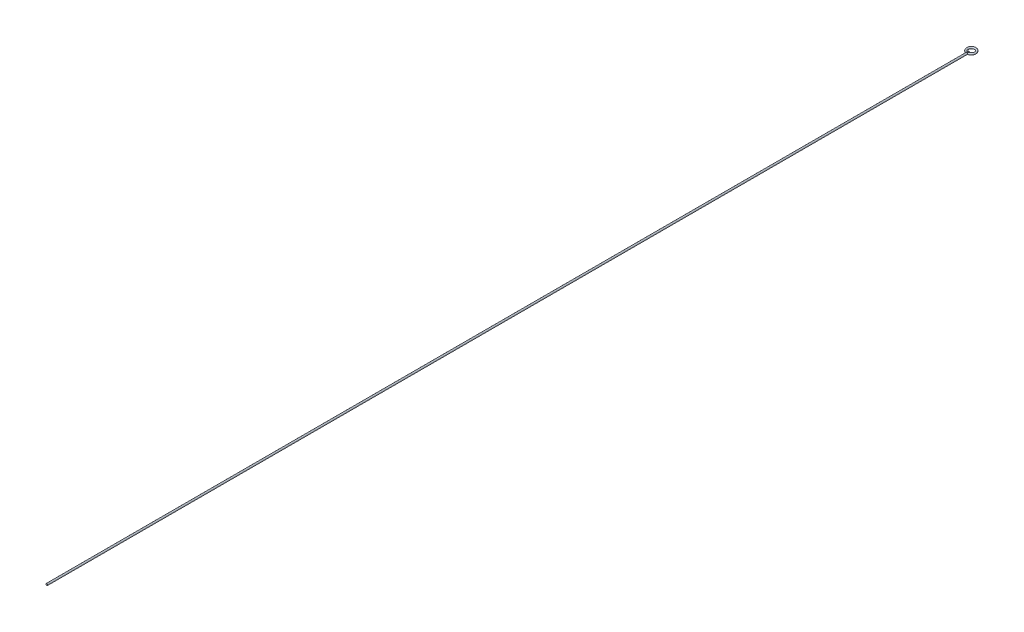
ISO-10303-21;
HEADER;
FILE_DESCRIPTION(('STEP AP214'),'2;1');
FILE_NAME('part.step','',(''),(''),'','','');
FILE_SCHEMA(('AUTOMOTIVE_DESIGN { 1 0 10303 214 1 1 1 1 }'));
ENDSEC;
DATA;
#1=APPLICATION_CONTEXT('core data for automotive mechanical design processes');
#2=APPLICATION_PROTOCOL_DEFINITION('international standard','automotive_design',2000,#1);
#3=PRODUCT_CONTEXT('',#1,'mechanical');
#4=PRODUCT('Part','Part','',(#3));
#5=PRODUCT_RELATED_PRODUCT_CATEGORY('part','',(#4));
#6=PRODUCT_DEFINITION_FORMATION('','',#4);
#7=PRODUCT_DEFINITION_CONTEXT('part definition',#1,'design');
#8=PRODUCT_DEFINITION('design','',#6,#7);
#9=PRODUCT_DEFINITION_SHAPE('','',#8);
#10=(LENGTH_UNIT() NAMED_UNIT(*) SI_UNIT(.MILLI.,.METRE.));
#11=(NAMED_UNIT(*) PLANE_ANGLE_UNIT() SI_UNIT($,.RADIAN.));
#12=(NAMED_UNIT(*) SI_UNIT($,.STERADIAN.) SOLID_ANGLE_UNIT());
#13=UNCERTAINTY_MEASURE_WITH_UNIT(LENGTH_MEASURE(1.E-05),#10,'distance_accuracy_value','');
#14=(GEOMETRIC_REPRESENTATION_CONTEXT(3) GLOBAL_UNCERTAINTY_ASSIGNED_CONTEXT((#13)) GLOBAL_UNIT_ASSIGNED_CONTEXT((#10,
#11,#12)) REPRESENTATION_CONTEXT('',''));
#15=CARTESIAN_POINT('',(0.,0.,0.));
#16=DIRECTION('',(0.,0.,1.));
#17=DIRECTION('',(1.,0.,0.));
#18=AXIS2_PLACEMENT_3D('',#15,#16,#17);
#19=CARTESIAN_POINT('',(0.,0.,2156.));
#20=DIRECTION('',(0.,0.,-1.));
#21=DIRECTION('',(-1.,0.,0.));
#22=AXIS2_PLACEMENT_3D('',#19,#20,#21);
#23=CYLINDRICAL_SURFACE('',#22,2.);
#24=CARTESIAN_POINT('',(0.,0.,6.));
#25=DIRECTION('',(0.,0.,1.));
#26=DIRECTION('',(1.,0.,0.));
#27=AXIS2_PLACEMENT_3D('',#24,#25,#26);
#28=CIRCLE('',#27,2.);
#29=CARTESIAN_POINT('',(2.,0.,6.));
#30=VERTEX_POINT('',#29);
#31=EDGE_CURVE('E143',#30,#30,#28,.T.);
#32=ORIENTED_EDGE('',*,*,#31,.T.);
#33=EDGE_LOOP('',(#32));
#34=FACE_BOUND('',#33,.T.);
#35=CARTESIAN_POINT('',(0.,0.,8.99999999999995));
#36=DIRECTION('',(0.,-0.707106781186547,-0.707106781186547));
#37=DIRECTION('',(0.,0.707106781186547,-0.707106781186547));
#38=AXIS2_PLACEMENT_3D('',#35,#36,#37);
#39=ELLIPSE('',#38,2.82842712474619,2.);
#40=CARTESIAN_POINT('',(1.35264002569453,1.47321585685503,7.52678414314496));
#41=VERTEX_POINT('',#40);
#42=CARTESIAN_POINT('',(-1.35264002569453,1.47321585685503,7.52678414314496));
#43=VERTEX_POINT('',#42);
#44=EDGE_CURVE('E66',#41,#43,#39,.F.);
#45=ORIENTED_EDGE('',*,*,#44,.F.);
#46=CARTESIAN_POINT('',(0.,2.,9.));
#47=CARTESIAN_POINT('',(0.00210812272485549,1.99999999524163,8.99789188802901));
#48=CARTESIAN_POINT('',(0.00421593956644162,1.99999666225178,8.99578333024149));
#49=CARTESIAN_POINT('',(0.167613924135622,1.99948039837144,8.83226960574343));
#50=CARTESIAN_POINT('',(0.327073545426945,1.97949150565761,8.66829200657743));
#51=CARTESIAN_POINT('',(0.559345306955797,1.92185890331424,8.42250655543371));
#52=CARTESIAN_POINT('',(0.635774550072601,1.89795770338682,8.34043033607726));
#53=CARTESIAN_POINT('',(0.785828632202429,1.84089832490799,8.17690254413226));
#54=CARTESIAN_POINT('',(0.859454740640768,1.80774439459674,8.09545070246308));
#55=CARTESIAN_POINT('',(0.986802312314143,1.74073148220367,7.95244891859763));
#56=CARTESIAN_POINT('',(1.04121847231176,1.70877538708495,7.89061593086873));
#57=CARTESIAN_POINT('',(1.14772281824378,1.63913978914488,7.7681871378529));
#58=CARTESIAN_POINT('',(1.19981153935845,1.60146161093816,7.70759104990733));
#59=CARTESIAN_POINT('',(1.30118823189935,1.5202366704838,7.58829101877278));
#60=CARTESIAN_POINT('',(1.35048232911553,1.47670351006603,7.52958306965177));
#61=CARTESIAN_POINT('',(1.44590645589761,1.3834030904459,7.41464671127423));
#62=CARTESIAN_POINT('',(1.49203807201466,1.3336389931221,7.35841706383646));
#63=CARTESIAN_POINT('',(1.59107508834011,1.21482851937822,7.23637955182586));
#64=CARTESIAN_POINT('',(1.64298967668924,1.14400888206332,7.17146570606956));
#65=CARTESIAN_POINT('',(1.73936977351839,0.991323551090359,7.04947167026083));
#66=CARTESIAN_POINT('',(1.78384415074728,0.909471221739623,6.99238216846505));
#67=CARTESIAN_POINT('',(1.85334026653697,0.755288037111378,6.9022751968222));
#68=CARTESIAN_POINT('',(1.88046912857674,0.685383347646647,6.86676841761969));
#69=CARTESIAN_POINT('',(1.92743179933544,0.539316860970757,6.80493837359133));
#70=CARTESIAN_POINT('',(1.94727704682289,0.463165106806872,6.77860071222888));
#71=CARTESIAN_POINT('',(1.97556961285693,0.318783066173252,6.74092329606359));
#72=CARTESIAN_POINT('',(1.98534423195506,0.251273624055717,6.7278429328771));
#73=CARTESIAN_POINT('',(1.99790013385232,0.114464445911381,6.7110261722765));
#74=CARTESIAN_POINT('',(2.00068618016804,0.0451659618898008,6.70728341022207));
#75=CARTESIAN_POINT('',(1.99902507748093,-0.0932269459276112,6.70951183766348));
#76=CARTESIAN_POINT('',(1.99457331702574,-0.162321211505731,6.71548922019384));
#77=CARTESIAN_POINT('',(1.97881704351064,-0.298296919509378,6.73657185136085));
#78=CARTESIAN_POINT('',(1.96750720820041,-0.365176600738755,6.75168418920589));
#79=CARTESIAN_POINT('',(1.93506816593579,-0.512441459084677,6.79480275118913));
#80=CARTESIAN_POINT('',(1.91213546025074,-0.591734040697845,6.82515897002035));
#81=CARTESIAN_POINT('',(1.85856088034207,-0.743125211635407,6.89544348555838));
#82=CARTESIAN_POINT('',(1.82790417359937,-0.815209582570209,6.93539019199368));
#83=CARTESIAN_POINT('',(1.74457274468806,-0.984436833153287,7.04285113385104));
#84=CARTESIAN_POINT('',(1.6883570290898,-1.07721453123317,7.11444602840009));
#85=CARTESIAN_POINT('',(1.56655663215454,-1.24776658358752,7.26689981805269));
#86=CARTESIAN_POINT('',(1.50095088388114,-1.32550625145298,7.34777946086476));
#87=CARTESIAN_POINT('',(1.37952593702835,-1.45000149540649,7.49483605281066));
#88=CARTESIAN_POINT('',(1.32520348461172,-1.49969547185001,7.55980886574149));
#89=CARTESIAN_POINT('',(1.21314827324628,-1.5917071804358,7.69205451956285));
#90=CARTESIAN_POINT('',(1.15541377381436,-1.63402110376991,7.75932852679196));
#91=CARTESIAN_POINT('',(1.03704301514678,-1.71159292484037,7.89543290864361));
#92=CARTESIAN_POINT('',(0.976405158426919,-1.74684688145539,7.96426412882959));
#93=CARTESIAN_POINT('',(0.852660755306097,-1.81047203631426,8.10289576687222));
#94=CARTESIAN_POINT('',(0.78955348783574,-1.83884120651604,8.17269646392042));
#95=CARTESIAN_POINT('',(0.610804546614742,-1.90841633093616,8.36786297402596));
#96=CARTESIAN_POINT('',(0.492836854291632,-1.942200198497,8.49380520408929));
#97=CARTESIAN_POINT('',(0.252404421297302,-1.98776362380408,8.74485234646825));
#98=CARTESIAN_POINT('',(0.129951986381222,-1.99959937761332,8.86995857770249));
#99=CARTESIAN_POINT('',(0.00421596897733761,-1.99999666242279,8.99578329472263));
#100=CARTESIAN_POINT('',(0.00210815236588643,-1.99999999546546,8.99789185220298));
#101=CARTESIAN_POINT('',(0.,-2.,9.));
#102=B_SPLINE_CURVE_WITH_KNOTS('',3,(#46,#47,#48,#49,#50,#51,#52,#53,#54,#55,#56,#57,#58,#59,
#60,#61,#62,#63,#64,#65,#66,#67,#68,#69,#70,#71,#72,#73,#74,#75,#76,#77,#78,#79,#80,#81,#82,#83,
#84,#85,#86,#87,#88,#89,#90,#91,#92,#93,#94,#95,#96,#97,#98,#99,#100,#101),.UNSPECIFIED.,.F.,
.F.,(4,2,2,2,2,2,2,2,2,2,2,2,2,2,2,2,2,2,2,2,2,2,2,2,2,2,2,4),(0.,0.00894427763439276,
0.693463340548152,1.03721792390917,1.38081493688326,1.64566760393445,1.91045905299039,
2.17464565570114,2.43869873659253,2.765420344639,3.09174968111581,3.33979698238755,
3.58745304642157,3.7949062300617,4.00221797201264,4.20966185108035,4.41726692462344,
4.67964926094177,4.94253934644232,5.33032605505973,5.71899682912705,6.01320435682701,
6.30756327711401,6.60208606362033,6.8966955022802,7.42273283312614,7.94742142567657,
7.95636570331097),.UNSPECIFIED.);
#103=CARTESIAN_POINT('',(0.,-2.,9.));
#104=VERTEX_POINT('',#103);
#105=EDGE_CURVE('E87',#41,#104,#102,.T.);
#106=ORIENTED_EDGE('',*,*,#105,.T.);
#107=CARTESIAN_POINT('',(0.,-2.,9.));
#108=CARTESIAN_POINT('',(-0.00210812281673464,-1.99999999522043,8.99789188791853));
#109=CARTESIAN_POINT('',(-0.00421593965739362,-1.99999666223077,8.99578333013208));
#110=CARTESIAN_POINT('',(-0.167560181324545,-1.99948056975998,8.8323233880122));
#111=CARTESIAN_POINT('',(-0.32696675195338,-1.97950494761941,8.66840191870725));
#112=CARTESIAN_POINT('',(-0.559216059382703,-1.92189753031176,8.42264488964913));
#113=CARTESIAN_POINT('',(-0.63567067494967,-1.89799351522413,8.34054262259513));
#114=CARTESIAN_POINT('',(-0.785775657620221,-1.84092214721491,8.17696118579845));
#115=CARTESIAN_POINT('',(-0.85942716648386,-1.80775861277157,8.09548177340016));
#116=CARTESIAN_POINT('',(-0.9920433812676,-1.73797377007946,7.94656350032068));
#117=CARTESIAN_POINT('',(-1.05150167163175,-1.70270752073526,7.87892428965972));
#118=CARTESIAN_POINT('',(-1.16759156470104,-1.62529867063073,7.74518027672068));
#119=CARTESIAN_POINT('',(-1.22422391693607,-1.58315790600938,7.67907507009051));
#120=CARTESIAN_POINT('',(-1.33400361220664,-1.49181720763244,7.54931319009775));
#121=CARTESIAN_POINT('',(-1.38716151471322,-1.44264026506811,7.48564936654748));
#122=CARTESIAN_POINT('',(-1.48950133830031,-1.33671412704701,7.36157721996779));
#123=CARTESIAN_POINT('',(-1.53868650148317,-1.27997120842671,7.30116625602252));
#124=CARTESIAN_POINT('',(-1.63590185236871,-1.15355006440853,7.18036815228713));
#125=CARTESIAN_POINT('',(-1.6835409610825,-1.08320730338549,7.12035228256487));
#126=CARTESIAN_POINT('',(-1.77153892677512,-0.932338035959171,7.00824014783504));
#127=CARTESIAN_POINT('',(-1.81190780169888,-0.851825806987339,6.95613300090427));
#128=CARTESIAN_POINT('',(-1.87496019578697,-0.699769267514736,6.87400995593979));
#129=CARTESIAN_POINT('',(-1.89957878737217,-0.630307364371497,6.8416626964872));
#130=CARTESIAN_POINT('',(-1.94158368263275,-0.485699315960796,6.78618200054536));
#131=CARTESIAN_POINT('',(-1.95897695801999,-0.410558733207491,6.76303968312301));
#132=CARTESIAN_POINT('',(-1.98521163434984,-0.255306637811716,6.72803925667524));
#133=CARTESIAN_POINT('',(-1.99396192801052,-0.175151445237371,6.71630138469673));
#134=CARTESIAN_POINT('',(-2.0015846199076,-0.0135488722900314,6.70608008295928));
#135=CARTESIAN_POINT('',(-2.00046509167047,0.0678973975459251,6.70758581990957));
#136=CARTESIAN_POINT('',(-1.98944469125792,0.21629550290041,6.72235289941695));
#137=CARTESIAN_POINT('',(-1.98092098145687,0.283549889390735,6.73377046536731));
#138=CARTESIAN_POINT('',(-1.9576135231973,0.4149813990234,6.76485012458238));
#139=CARTESIAN_POINT('',(-1.94282623610741,0.479156759807489,6.78451687819511));
#140=CARTESIAN_POINT('',(-1.90100607177353,0.62791180686494,6.83980377475538));
#141=CARTESIAN_POINT('',(-1.87144395301354,0.710568557822906,6.87865656362555));
#142=CARTESIAN_POINT('',(-1.8042867883329,0.867089095996453,6.96597031107501));
#143=CARTESIAN_POINT('',(-1.76667353305592,0.94093234988721,7.01445303157465));
#144=CARTESIAN_POINT('',(-1.69516895751138,1.06307112096457,7.1055265444169));
#145=CARTESIAN_POINT('',(-1.66258173877175,1.11322320659098,7.14670138154396));
#146=CARTESIAN_POINT('',(-1.59444312510289,1.20879941091162,7.23200179048099));
#147=CARTESIAN_POINT('',(-1.55889023135597,1.25422111253153,7.27612885205345));
#148=CARTESIAN_POINT('',(-1.44836058319067,1.38390360382743,7.41199469228825));
#149=CARTESIAN_POINT('',(-1.36959019508658,1.46145491791321,7.50711893013921));
#150=CARTESIAN_POINT('',(-1.22702739334483,1.58131390002394,7.67584622558699));
#151=CARTESIAN_POINT('',(-1.1649715539871,1.62747453778939,7.74828398318769));
#152=CARTESIAN_POINT('',(-1.0374568327385,1.71158359329953,7.89500780835266));
#153=CARTESIAN_POINT('',(-0.97199625749404,1.74952787523423,7.96929478586714));
#154=CARTESIAN_POINT('',(-0.838300428260966,1.81737917623812,8.11887848848734));
#155=CARTESIAN_POINT('',(-0.770067593052083,1.84729303549615,8.19417429651397));
#156=CARTESIAN_POINT('',(-0.631214355133998,1.89922653631293,8.34528911285155));
#157=CARTESIAN_POINT('',(-0.560593827584704,1.92124576440157,8.42110814835391));
#158=CARTESIAN_POINT('',(-0.410456441955563,1.95910382152955,8.58013428661545));
#159=CARTESIAN_POINT('',(-0.33074062401078,1.97413702807548,8.66334538900742));
#160=CARTESIAN_POINT('',(-0.1696324996886,1.99444291521224,8.82912635111679));
#161=CARTESIAN_POINT('',(-0.0882430568500704,1.99973105887858,8.91169701933976));
#162=CARTESIAN_POINT('',(-0.00421597799849515,1.99999666510451,8.99578328341028));
#163=CARTESIAN_POINT('',(-0.00210816129678702,1.99999999825347,8.99789184094395));
#164=CARTESIAN_POINT('',(0.,2.,9.));
#165=B_SPLINE_CURVE_WITH_KNOTS('',3,(#107,#108,#109,#110,#111,#112,#113,#114,#115,#116,#117,
#118,#119,#120,#121,#122,#123,#124,#125,#126,#127,#128,#129,#130,#131,#132,#133,#134,#135,#136,
#137,#138,#139,#140,#141,#142,#143,#144,#145,#146,#147,#148,#149,#150,#151,#152,#153,#154,#155,
#156,#157,#158,#159,#160,#161,#162,#163,#164),.UNSPECIFIED.,.F.,.F.,(4,2,2,2,2,2,2,2,2,2,2,2,2,
2,2,2,2,2,2,2,2,2,2,2,2,2,2,2,4),(0.,0.00894427763439247,0.693235284872066,1.03709620770501,
1.38081553668151,1.67070137815846,1.96050991937383,2.2493922465932,2.53803638718291,
2.84925187412126,3.16003518783422,3.40061645321139,3.64096503933566,3.88382097631995,
4.12647827529289,4.3318119603711,4.53726180452924,4.82365829646621,5.11070951146949,
5.32825416948067,5.54590944600044,5.98174983211696,6.29931050487529,6.61703065626395,
6.93447931365045,7.2519445945319,7.60017195305405,7.94784628099176,7.95679055862615),.UNSPECIFIED.);
#166=EDGE_CURVE('E57',#104,#43,#165,.T.);
#167=ORIENTED_EDGE('',*,*,#166,.T.);
#168=EDGE_LOOP('',(#45,#106,#167));
#169=FACE_BOUND('',#168,.T.);
#170=ADVANCED_FACE('F50',(#34,#169),#23,.T.);
#171=CARTESIAN_POINT('',(0.,0.,0.));
#172=DIRECTION('',(0.,1.,0.));
#173=DIRECTION('',(0.,0.,1.));
#174=AXIS2_PLACEMENT_3D('',#171,#172,#173);
#175=TOROIDAL_SURFACE('',#174,9.,2.);
#176=CARTESIAN_POINT('',(0.,-2.,9.));
#177=CARTESIAN_POINT('',(-0.00210813566360726,-1.99999999621851,9.00210814033236));
#178=CARTESIAN_POINT('',(-0.00421669348929261,-1.99999666316268,9.00421595728533));
#179=CARTESIAN_POINT('',(-0.12548305339383,-1.99961332650367,9.12539691573438));
#180=CARTESIAN_POINT('',(-0.245964359588998,-1.98859475135822,9.24341809029718));
#181=CARTESIAN_POINT('',(-0.487109149983447,-1.94365693286957,9.47530639674726));
#182=CARTESIAN_POINT('',(-0.607772571942503,-1.90969652209743,9.58916567258907));
#183=CARTESIAN_POINT('',(-0.834074541954399,-1.82142087642756,9.79914559797621));
#184=CARTESIAN_POINT('',(-0.940019055922948,-1.76945017202415,9.89590704603683));
#185=CARTESIAN_POINT('',(-1.14583570608838,-1.64364373365732,10.0813493120836));
#186=CARTESIAN_POINT('',(-1.24571685416162,-1.56984145663594,10.170042225139));
#187=CARTESIAN_POINT('',(-1.4136189137677,-1.41825875657198,10.3174275833848));
#188=CARTESIAN_POINT('',(-1.48376905953368,-1.3450605100989,10.3783930320642));
#189=CARTESIAN_POINT('',(-1.61471790048577,-1.18463880690381,10.4913345793827));
#190=CARTESIAN_POINT('',(-1.67552761245912,-1.09743212513255,10.5433212773641));
#191=CARTESIAN_POINT('',(-1.77478428716533,-0.926353710318032,10.6276798861735));
#192=CARTESIAN_POINT('',(-1.81528312788267,-0.84458727760655,10.6618932176933));
#193=CARTESIAN_POINT('',(-1.88550324495746,-0.673365369382744,10.7210043740859));
#194=CARTESIAN_POINT('',(-1.9152296699809,-0.583913592431083,10.7459066493507));
#195=CARTESIAN_POINT('',(-1.96214448660349,-0.398924072215992,10.7851283867986));
#196=CARTESIAN_POINT('',(-1.97925899264492,-0.303353974877754,10.7993854917399));
#197=CARTESIAN_POINT('',(-1.99935443664308,-0.109726153581529,10.8161201338528));
#198=CARTESIAN_POINT('',(-2.00234163694619,-0.01166955122383,10.8186028903542));
#199=CARTESIAN_POINT('',(-1.99439135361487,0.173587411449419,10.8119863102));
#200=CARTESIAN_POINT('',(-1.98481672561042,0.260892659605481,10.8040205709291));
#201=CARTESIAN_POINT('',(-1.95468015907166,0.432190521398464,10.7788867370267));
#202=CARTESIAN_POINT('',(-1.93411849795593,0.516183218618588,10.7617188747453));
#203=CARTESIAN_POINT('',(-1.88288386691657,0.679849447135278,10.7187858931498));
#204=CARTESIAN_POINT('',(-1.85209142640975,0.75945833048192,10.6929191463783));
#205=CARTESIAN_POINT('',(-1.78201198567968,0.911856242748462,10.6337712400145));
#206=CARTESIAN_POINT('',(-1.74272089255953,0.984641961381502,10.6004865077324));
#207=CARTESIAN_POINT('',(-1.64073809578724,1.14917511418757,10.5136014862792));
#208=CARTESIAN_POINT('',(-1.57486133376123,1.23743276935939,10.4571135343963));
#209=CARTESIAN_POINT('',(-1.43364590451805,1.39864089505199,10.3348623366671));
#210=CARTESIAN_POINT('',(-1.35828953628894,1.47156202918398,10.2690817098407));
#211=CARTESIAN_POINT('',(-1.17672911837757,1.62273840358883,10.1088750766247));
#212=CARTESIAN_POINT('',(-1.06823938784045,1.69555124601216,10.0119175958925));
#213=CARTESIAN_POINT('',(-0.845624349368952,1.81687322449657,9.80976484388612));
#214=CARTESIAN_POINT('',(-0.731493260565011,1.86535683770973,9.70456105490035));
#215=CARTESIAN_POINT('',(-0.514979017282203,1.93550014935202,9.50150988048361));
#216=CARTESIAN_POINT('',(-0.412808723642618,1.95965999756638,9.40427073941701));
#217=CARTESIAN_POINT('',(-0.208890587943532,1.99173089977155,9.20704773317217));
#218=CARTESIAN_POINT('',(-0.107142316156886,1.99967122691566,9.10706914339473));
#219=CARTESIAN_POINT('',(-0.00421670053831873,1.9999966647455,9.00421596331506));
#220=CARTESIAN_POINT('',(-0.00210814271059113,1.9999999978573,9.00210814634574));
#221=CARTESIAN_POINT('',(0.,2.,9.));
#222=B_SPLINE_CURVE_WITH_KNOTS('',3,(#176,#177,#178,#179,#180,#181,#182,#183,#184,#185,#186,
#187,#188,#189,#190,#191,#192,#193,#194,#195,#196,#197,#198,#199,#200,#201,#202,#203,#204,#205,
#206,#207,#208,#209,#210,#211,#212,#213,#214,#215,#216,#217,#218,#219,#220,#221),.UNSPECIFIED.,
.F.,.F.,(4,2,2,2,2,2,2,2,2,2,2,2,2,2,2,2,2,2,2,2,2,2,4),(0.,0.00894427764205546,
0.514297822774271,1.0205606047617,1.47676775267206,1.93227935231262,2.28590440078253,
2.63910910129282,2.93026688790138,3.22128533180887,3.51399540911486,3.80657572184656,
4.06989231205833,4.33320225393652,4.59970192125942,4.86633022002375,5.23562030895417,
5.60561049390473,6.09111315566196,6.57712408012804,7.005468666335,7.4330394864561,
7.44198376409816),.UNSPECIFIED.);
#223=CARTESIAN_POINT('',(-1.46478627664232,1.36176398974283,10.3617639897636));
#224=VERTEX_POINT('',#223);
#225=EDGE_CURVE('E83',#224,#104,#222,.F.);
#226=ORIENTED_EDGE('',*,*,#225,.F.);
#227=CARTESIAN_POINT('',(-0.278984328329074,0.252555034282111,10.9804463498279));
#228=CARTESIAN_POINT('',(-0.341032299275194,0.308816785711044,10.971697312331));
#229=CARTESIAN_POINT('',(-0.402787175520897,0.364904444712523,10.9600313604992));
#230=CARTESIAN_POINT('',(-0.525405712639506,0.476579760990675,10.930785774125));
#231=CARTESIAN_POINT('',(-0.586268843536572,0.532167113918051,10.9132027608011));
#232=CARTESIAN_POINT('',(-0.767694114446806,0.698530893909304,10.8512261129245));
#233=CARTESIAN_POINT('',(-0.886323086517937,0.808214805253446,10.797709873668));
#234=CARTESIAN_POINT('',(-1.10449743191817,1.01271340929389,10.6716938216711));
#235=CARTESIAN_POINT('',(-1.20480471291837,1.1079902921113,10.6012588714503));
#236=CARTESIAN_POINT('',(-1.39417858581926,1.29132333733151,10.4393473254541));
#237=CARTESIAN_POINT('',(-1.48327356267481,1.37939752741099,10.3479255891005));
#238=CARTESIAN_POINT('',(-1.62635756425338,1.52501793389885,10.1682545141693));
#239=CARTESIAN_POINT('',(-1.68364716228215,1.58482859193742,10.0844720782639));
#240=CARTESIAN_POINT('',(-1.78657695772627,1.69594632219661,9.90488576402343));
#241=CARTESIAN_POINT('',(-1.83223017729539,1.74726287732439,9.8090955042804));
#242=CARTESIAN_POINT('',(-1.90110327409864,1.82917694209918,9.62711331274587));
#243=CARTESIAN_POINT('',(-1.9269902975717,1.86186577547437,9.54287986653186));
#244=CARTESIAN_POINT('',(-1.96772932464872,1.91803808059917,9.36879939928997));
#245=CARTESIAN_POINT('',(-1.98258736073887,1.94152658129644,9.27895547620386));
#246=CARTESIAN_POINT('',(-1.99988550650642,1.97751775227634,9.09509029651349));
#247=CARTESIAN_POINT('',(-2.00222547074295,1.98993116631186,9.00104140349721));
#248=CARTESIAN_POINT('',(-1.99343855447658,2.00184136461934,8.81276236079122));
#249=CARTESIAN_POINT('',(-1.98232357275786,2.00134955358552,8.71853244472223));
#250=CARTESIAN_POINT('',(-1.94945124558754,1.98787383671371,8.545742041081));
#251=CARTESIAN_POINT('',(-1.92927472739967,1.97653104786835,8.46674323998275));
#252=CARTESIAN_POINT('',(-1.8802445945597,1.9441425260652,8.31360003088698));
#253=CARTESIAN_POINT('',(-1.85139024102706,1.92309596679151,8.23945603691038));
#254=CARTESIAN_POINT('',(-1.78647810372815,1.87228462849486,8.09744024527687));
#255=CARTESIAN_POINT('',(-1.75040456498548,1.8425007138606,8.02958264921749));
#256=CARTESIAN_POINT('',(-1.67273510562387,1.775591134665,7.901090213176));
#257=CARTESIAN_POINT('',(-1.63113712065219,1.73846272309056,7.84045808932736));
#258=CARTESIAN_POINT('',(-1.51966530693271,1.63595602016267,7.69498754403719));
#259=CARTESIAN_POINT('',(-1.4468988727737,1.56632630725528,7.61536016202647));
#260=CARTESIAN_POINT('',(-1.29554727273083,1.41689166603998,7.4727694003756));
#261=CARTESIAN_POINT('',(-1.21694506020552,1.33705639383153,7.4098575114432));
#262=CARTESIAN_POINT('',(-1.07647731662475,1.19121159753111,7.31282586876721));
#263=CARTESIAN_POINT('',(-1.01528633060277,1.12667292415188,7.27543401999356));
#264=CARTESIAN_POINT('',(-0.891732713458826,0.994686038754979,7.20842059482677));
#265=CARTESIAN_POINT('',(-0.829369415231154,0.927236139956455,7.17880359555519));
#266=CARTESIAN_POINT('',(-0.703957264882275,0.790267081339172,7.12675337578009));
#267=CARTESIAN_POINT('',(-0.640908411073402,0.720747916425671,7.10432017296539));
#268=CARTESIAN_POINT('',(-0.514428022286602,0.580297397907398,7.06616318299553));
#269=CARTESIAN_POINT('',(-0.450996645568032,0.509366603673868,7.05043679150805));
#270=CARTESIAN_POINT('',(-0.323965494201565,0.366657387279736,7.02535199039301));
#271=CARTESIAN_POINT('',(-0.260365898896941,0.294879702930309,7.01598840209356));
#272=CARTESIAN_POINT('',(-0.133144091242998,0.150965904072657,7.00341492179225));
#273=CARTESIAN_POINT('',(-0.0695220246822158,0.0788304023982243,7.00019676003563));
#274=CARTESIAN_POINT('',(-0.00394403870693451,0.00447211926849953,7.00000292094687));
#275=CARTESIAN_POINT('',(-0.00197201055846326,0.00223604965939209,7.00000000461182));
#276=CARTESIAN_POINT('',(0.,0.,6.99999999999994));
#277=B_SPLINE_CURVE_WITH_KNOTS('',3,(#227,#228,#229,#230,#231,#232,#233,#234,#235,#236,#237,
#238,#239,#240,#241,#242,#243,#244,#245,#246,#247,#248,#249,#250,#251,#252,#253,#254,#255,#256,
#257,#258,#259,#260,#261,#262,#263,#264,#265,#266,#267,#268,#269,#270,#271,#272,#273,#274,#275,
#276),.UNSPECIFIED.,.F.,.F.,(4,2,2,2,2,2,2,2,2,2,2,2,2,2,2,2,2,2,2,2,2,2,2,2,4),(0.,
0.252525007273027,0.505194457653169,1.01362887360167,1.47768174343743,1.94053512102782,
2.29273223056546,2.64453345203281,2.925407340084,3.20612748610629,3.48909009077905,
3.77180264222164,4.01756468907104,4.26334766743381,4.50967300376842,4.75609064631938,
5.13909450396268,5.52326484315896,5.81231843331428,6.1015418121403,6.39076590312239,
6.67987758256171,6.96875367187785,7.25724075279862,7.26618502898769),.UNSPECIFIED.);
#278=EDGE_CURVE('E64',#224,#43,#277,.T.);
#279=ORIENTED_EDGE('',*,*,#278,.T.);
#280=ORIENTED_EDGE('',*,*,#166,.F.);
#281=EDGE_LOOP('',(#226,#279,#280));
#282=FACE_BOUND('',#281,.T.);
#283=ORIENTED_EDGE('',*,*,#105,.F.);
#284=CARTESIAN_POINT('',(0.,0.,6.99999999999994));
#285=CARTESIAN_POINT('',(0.00197200558539978,0.00223604415623799,7.00000000726764));
#286=CARTESIAN_POINT('',(0.00394403367869625,0.00447211383449829,7.00000292351707));
#287=CARTESIAN_POINT('',(0.086309510355738,0.0978655855921385,7.00024627615483));
#288=CARTESIAN_POINT('',(0.166736821605377,0.18905342113691,7.00532037436683));
#289=CARTESIAN_POINT('',(0.327444795800098,0.370596847578183,7.02532394244063));
#290=CARTESIAN_POINT('',(0.407725259679,0.460951608979088,7.04026234333921));
#291=CARTESIAN_POINT('',(0.567879896610451,0.639882864434265,7.08053740597835));
#292=CARTESIAN_POINT('',(0.647753628116782,0.728457646675771,7.1058836179045));
#293=CARTESIAN_POINT('',(0.806444403308602,0.902453230817283,7.16781686480063));
#294=CARTESIAN_POINT('',(0.885262439152536,0.987877149100629,7.20439244012978));
#295=CARTESIAN_POINT('',(1.04564486296813,1.15898062137926,7.29251965623021));
#296=CARTESIAN_POINT('',(1.12710034671618,1.24438304255954,7.34482194644957));
#297=CARTESIAN_POINT('',(1.28610504507349,1.40733023796999,7.46512479010024));
#298=CARTESIAN_POINT('',(1.36366150778746,1.48488988537231,7.53309479608316));
#299=CARTESIAN_POINT('',(1.49756871468223,1.61469797300902,7.67158913901954));
#300=CARTESIAN_POINT('',(1.55511522853616,1.66893816948891,7.7390623418424));
#301=CARTESIAN_POINT('',(1.66336950177998,1.76752948086768,7.88578374284636));
#302=CARTESIAN_POINT('',(1.71408570020292,1.81189284396914,7.9650171516315));
#303=CARTESIAN_POINT('',(1.79711596910519,1.88090689029902,8.11879309318628));
#304=CARTESIAN_POINT('',(1.83109831493492,1.90768893584303,8.19147006163587));
#305=CARTESIAN_POINT('',(1.89073428464265,1.95152621952012,8.34293718373426));
#306=CARTESIAN_POINT('',(1.91639339079346,1.96858786581904,8.42172327093353));
#307=CARTESIAN_POINT('',(1.95797599907966,1.99218097146844,8.58366027549327));
#308=CARTESIAN_POINT('',(1.97386558511434,1.99867587404283,8.66682532257792));
#309=CARTESIAN_POINT('',(1.9949467082737,2.00095739395134,8.83464786754227));
#310=CARTESIAN_POINT('',(2.00013648924427,1.99674225370444,8.91930560811777));
#311=CARTESIAN_POINT('',(1.99986498537268,1.97882488569162,9.08311828828159));
#312=CARTESIAN_POINT('',(1.9949386956797,1.96562264796312,9.16233201549185));
#313=CARTESIAN_POINT('',(1.97612867546671,1.93133293095876,9.3179011947627));
#314=CARTESIAN_POINT('',(1.96224320746574,1.91024392251082,9.39425608936153));
#315=CARTESIAN_POINT('',(1.92464215418107,1.85892642359147,9.55029763452883));
#316=CARTESIAN_POINT('',(1.90007625681985,1.82799058866414,9.62954341632031));
#317=CARTESIAN_POINT('',(1.8426167995583,1.75958201275042,9.78192698871827));
#318=CARTESIAN_POINT('',(1.80971758433926,1.72210483794423,9.85506058634919));
#319=CARTESIAN_POINT('',(1.71797400907648,1.62109322518337,10.030955991012));
#320=CARTESIAN_POINT('',(1.65452970899772,1.55413594148303,10.1293739473849));
#321=CARTESIAN_POINT('',(1.51540431846422,1.41176376183523,10.3101994714906));
#322=CARTESIAN_POINT('',(1.43969568884161,1.33632995169079,10.3925700664963));
#323=CARTESIAN_POINT('',(1.25606989383751,1.156982448241,10.5627369340911));
#324=CARTESIAN_POINT('',(1.14515978525165,1.05112797501227,10.6452506308595));
#325=CARTESIAN_POINT('',(0.913514852246209,0.833467275133547,10.7843060091386));
#326=CARTESIAN_POINT('',(0.79277725312767,0.721659370691553,10.8408403254659));
#327=CARTESIAN_POINT('',(0.605282623299159,0.549552452227408,10.9074164692394));
#328=CARTESIAN_POINT('',(0.540583762792071,0.490425763600587,10.9267299827533));
#329=CARTESIAN_POINT('',(0.410356584806322,0.371779468878348,10.9585901567271));
#330=CARTESIAN_POINT('',(0.34483237874118,0.312262225747122,10.9711623786155));
#331=CARTESIAN_POINT('',(0.278984328328222,0.252555034283174,10.9804463498283));
#332=B_SPLINE_CURVE_WITH_KNOTS('',3,(#284,#285,#286,#287,#288,#289,#290,#291,#292,#293,#294,
#295,#296,#297,#298,#299,#300,#301,#302,#303,#304,#305,#306,#307,#308,#309,#310,#311,#312,#313,
#314,#315,#316,#317,#318,#319,#320,#321,#322,#323,#324,#325,#326,#327,#328,#329,#330,#331),
.UNSPECIFIED.,.F.,.F.,(4,2,2,2,2,2,2,2,2,2,2,2,2,2,2,2,2,2,2,2,2,2,2,4),(0.,0.00894427618999834,
0.373570720432245,0.738527747131717,1.10382040864581,1.46874151872556,1.85500097537943,
2.24051361568764,2.55127046490325,2.86163977286961,3.11431912299534,3.36683170111989,
3.62021602994925,3.87364194332273,4.11401066402534,4.3544260141886,4.61909306662194,
4.88394021605999,5.28636627144298,5.68970881726486,6.20933895931852,6.729116326351,
6.99813996458008,7.26613618122504),.UNSPECIFIED.);
#333=CARTESIAN_POINT('',(1.46478627664232,1.36176398974283,10.3617639897636));
#334=VERTEX_POINT('',#333);
#335=EDGE_CURVE('E93',#41,#334,#332,.T.);
#336=ORIENTED_EDGE('',*,*,#335,.T.);
#337=CARTESIAN_POINT('',(0.,-2.,9.));
#338=CARTESIAN_POINT('',(0.00210813566360726,-1.99999999621851,9.00210814033236));
#339=CARTESIAN_POINT('',(0.00421669348929261,-1.99999666316268,9.00421595728533));
#340=CARTESIAN_POINT('',(0.12548305339383,-1.99961332650367,9.12539691573438));
#341=CARTESIAN_POINT('',(0.245964359588998,-1.98859475135822,9.24341809029718));
#342=CARTESIAN_POINT('',(0.487109149983447,-1.94365693286957,9.47530639674726));
#343=CARTESIAN_POINT('',(0.607772571942503,-1.90969652209743,9.58916567258907));
#344=CARTESIAN_POINT('',(0.834074541954399,-1.82142087642756,9.79914559797621));
#345=CARTESIAN_POINT('',(0.940019055922948,-1.76945017202415,9.89590704603683));
#346=CARTESIAN_POINT('',(1.14583570608838,-1.64364373365732,10.0813493120836));
#347=CARTESIAN_POINT('',(1.24571685416162,-1.56984145663594,10.170042225139));
#348=CARTESIAN_POINT('',(1.4136189137677,-1.41825875657198,10.3174275833848));
#349=CARTESIAN_POINT('',(1.48376905953368,-1.3450605100989,10.3783930320642));
#350=CARTESIAN_POINT('',(1.61471790048577,-1.18463880690381,10.4913345793827));
#351=CARTESIAN_POINT('',(1.67552761245912,-1.09743212513255,10.5433212773641));
#352=CARTESIAN_POINT('',(1.77478428716533,-0.926353710318032,10.6276798861735));
#353=CARTESIAN_POINT('',(1.81528312788267,-0.84458727760655,10.6618932176933));
#354=CARTESIAN_POINT('',(1.88550324495746,-0.673365369382744,10.7210043740859));
#355=CARTESIAN_POINT('',(1.9152296699809,-0.583913592431083,10.7459066493507));
#356=CARTESIAN_POINT('',(1.96214448660349,-0.398924072215992,10.7851283867986));
#357=CARTESIAN_POINT('',(1.97925899264492,-0.303353974877754,10.7993854917399));
#358=CARTESIAN_POINT('',(1.99935443664308,-0.109726153581529,10.8161201338528));
#359=CARTESIAN_POINT('',(2.00234163694619,-0.01166955122383,10.8186028903542));
#360=CARTESIAN_POINT('',(1.99439135361487,0.173587411449419,10.8119863102));
#361=CARTESIAN_POINT('',(1.98481672561042,0.260892659605481,10.8040205709291));
#362=CARTESIAN_POINT('',(1.95468015907166,0.432190521398464,10.7788867370267));
#363=CARTESIAN_POINT('',(1.93411849795593,0.516183218618588,10.7617188747453));
#364=CARTESIAN_POINT('',(1.88288386691657,0.679849447135278,10.7187858931498));
#365=CARTESIAN_POINT('',(1.85209142640975,0.75945833048192,10.6929191463783));
#366=CARTESIAN_POINT('',(1.78201198567968,0.911856242748462,10.6337712400145));
#367=CARTESIAN_POINT('',(1.74272089255953,0.984641961381502,10.6004865077324));
#368=CARTESIAN_POINT('',(1.64073809578724,1.14917511418757,10.5136014862792));
#369=CARTESIAN_POINT('',(1.57486133376123,1.23743276935939,10.4571135343963));
#370=CARTESIAN_POINT('',(1.43364590451805,1.39864089505199,10.3348623366671));
#371=CARTESIAN_POINT('',(1.35828953628894,1.47156202918398,10.2690817098407));
#372=CARTESIAN_POINT('',(1.17672911837757,1.62273840358883,10.1088750766247));
#373=CARTESIAN_POINT('',(1.06823938784045,1.69555124601216,10.0119175958925));
#374=CARTESIAN_POINT('',(0.845624349368952,1.81687322449657,9.80976484388612));
#375=CARTESIAN_POINT('',(0.731493260565011,1.86535683770973,9.70456105490035));
#376=CARTESIAN_POINT('',(0.514979017282203,1.93550014935202,9.50150988048361));
#377=CARTESIAN_POINT('',(0.412808723642618,1.95965999756638,9.40427073941701));
#378=CARTESIAN_POINT('',(0.208890587943532,1.99173089977155,9.20704773317217));
#379=CARTESIAN_POINT('',(0.107142316156886,1.99967122691566,9.10706914339473));
#380=CARTESIAN_POINT('',(0.00421670053831873,1.9999966647455,9.00421596331506));
#381=CARTESIAN_POINT('',(0.00210814271059113,1.9999999978573,9.00210814634574));
#382=CARTESIAN_POINT('',(0.,2.,9.));
#383=B_SPLINE_CURVE_WITH_KNOTS('',3,(#337,#338,#339,#340,#341,#342,#343,#344,#345,#346,#347,
#348,#349,#350,#351,#352,#353,#354,#355,#356,#357,#358,#359,#360,#361,#362,#363,#364,#365,#366,
#367,#368,#369,#370,#371,#372,#373,#374,#375,#376,#377,#378,#379,#380,#381,#382),.UNSPECIFIED.,
.F.,.F.,(4,2,2,2,2,2,2,2,2,2,2,2,2,2,2,2,2,2,2,2,2,2,4),(0.,0.00894427764205546,
0.514297822774271,1.0205606047617,1.47676775267206,1.93227935231262,2.28590440078253,
2.63910910129282,2.93026688790138,3.22128533180887,3.51399540911486,3.80657572184656,
4.06989231205833,4.33320225393652,4.59970192125942,4.86633022002375,5.23562030895417,
5.60561049390473,6.09111315566196,6.57712408012804,7.005468666335,7.4330394864561,
7.44198376409816),.UNSPECIFIED.);
#384=EDGE_CURVE('E85',#104,#334,#383,.T.);
#385=ORIENTED_EDGE('',*,*,#384,.F.);
#386=EDGE_LOOP('',(#283,#336,#385));
#387=FACE_BOUND('',#386,.T.);
#388=ADVANCED_FACE('F95',(#282,#387),#175,.T.);
#389=CARTESIAN_POINT('',(0.,0.,2156.));
#390=DIRECTION('',(0.,0.,1.));
#391=DIRECTION('',(1.,0.,0.));
#392=AXIS2_PLACEMENT_3D('',#389,#390,#391);
#393=CIRCLE('',#392,2.);
#394=CARTESIAN_POINT('',(2.,0.,2156.));
#395=VERTEX_POINT('',#394);
#396=EDGE_CURVE('E145',#395,#395,#393,.T.);
#397=ORIENTED_EDGE('',*,*,#396,.F.);
#398=EDGE_LOOP('',(#397));
#399=FACE_BOUND('',#398,.T.);
#400=CARTESIAN_POINT('',(0.,0.,8.99999999999995));
#401=DIRECTION('',(0.,0.707106781186547,-0.707106781186547));
#402=DIRECTION('',(0.,-0.707106781186547,-0.707106781186547));
#403=AXIS2_PLACEMENT_3D('',#400,#401,#402);
#404=ELLIPSE('',#403,2.82842712474619,2.);
#405=EDGE_CURVE('E11',#224,#334,#404,.T.);
#406=ORIENTED_EDGE('',*,*,#405,.F.);
#407=ORIENTED_EDGE('',*,*,#225,.T.);
#408=ORIENTED_EDGE('',*,*,#384,.T.);
#409=EDGE_LOOP('',(#406,#407,#408));
#410=FACE_BOUND('',#409,.T.);
#411=ADVANCED_FACE('F81',(#399,#410),#23,.T.);
#412=CARTESIAN_POINT('',(0.,0.,6.));
#413=DIRECTION('',(0.,0.,1.));
#414=DIRECTION('',(1.,0.,0.));
#415=AXIS2_PLACEMENT_3D('',#412,#413,#414);
#416=PLANE('',#415);
#417=ORIENTED_EDGE('',*,*,#31,.F.);
#418=EDGE_LOOP('',(#417));
#419=FACE_BOUND('',#418,.T.);
#420=ADVANCED_FACE('F131',(#419),#416,.F.);
#421=CARTESIAN_POINT('',(0.,0.,2156.));
#422=DIRECTION('',(0.,0.,1.));
#423=DIRECTION('',(1.,0.,0.));
#424=AXIS2_PLACEMENT_3D('',#421,#422,#423);
#425=PLANE('',#424);
#426=ORIENTED_EDGE('',*,*,#396,.T.);
#427=EDGE_LOOP('',(#426));
#428=FACE_BOUND('',#427,.T.);
#429=ADVANCED_FACE('F119',(#428),#425,.T.);
#430=CARTESIAN_POINT('',(0.,2.1,9.));
#431=DIRECTION('',(0.,-1.,0.));
#432=DIRECTION('',(0.,0.,-1.));
#433=AXIS2_PLACEMENT_3D('',#430,#431,#432);
#434=CYLINDRICAL_SURFACE('',#433,2.);
#435=CARTESIAN_POINT('',(0.,2.1,9.));
#436=DIRECTION('',(0.,1.,0.));
#437=DIRECTION('',(0.,0.,1.));
#438=AXIS2_PLACEMENT_3D('',#435,#436,#437);
#439=CIRCLE('',#438,2.);
#440=CARTESIAN_POINT('',(0.,2.1,11.));
#441=VERTEX_POINT('',#440);
#442=EDGE_CURVE('E96',#441,#441,#439,.T.);
#443=ORIENTED_EDGE('',*,*,#442,.F.);
#444=EDGE_LOOP('',(#443));
#445=FACE_BOUND('',#444,.T.);
#446=ORIENTED_EDGE('',*,*,#335,.F.);
#447=ORIENTED_EDGE('',*,*,#44,.T.);
#448=ORIENTED_EDGE('',*,*,#278,.F.);
#449=ORIENTED_EDGE('',*,*,#405,.T.);
#450=EDGE_LOOP('',(#446,#447,#448,#449));
#451=FACE_BOUND('',#450,.T.);
#452=ADVANCED_FACE('F98',(#445,#451),#434,.T.);
#453=CARTESIAN_POINT('',(0.,2.1,9.));
#454=DIRECTION('',(0.,1.,0.));
#455=DIRECTION('',(0.,0.,1.));
#456=AXIS2_PLACEMENT_3D('',#453,#454,#455);
#457=PLANE('',#456);
#458=ORIENTED_EDGE('',*,*,#442,.T.);
#459=EDGE_LOOP('',(#458));
#460=FACE_BOUND('',#459,.T.);
#461=ADVANCED_FACE('F118',(#460),#457,.T.);
#462=CLOSED_SHELL('',(#170,#388,#411,#420,#429,#452,#461));
#463=MANIFOLD_SOLID_BREP('B2',#462);
#464=ADVANCED_BREP_SHAPE_REPRESENTATION('',(#18,#463),#14);
#465=SHAPE_DEFINITION_REPRESENTATION(#9,#464);
ENDSEC;
END-ISO-10303-21;
